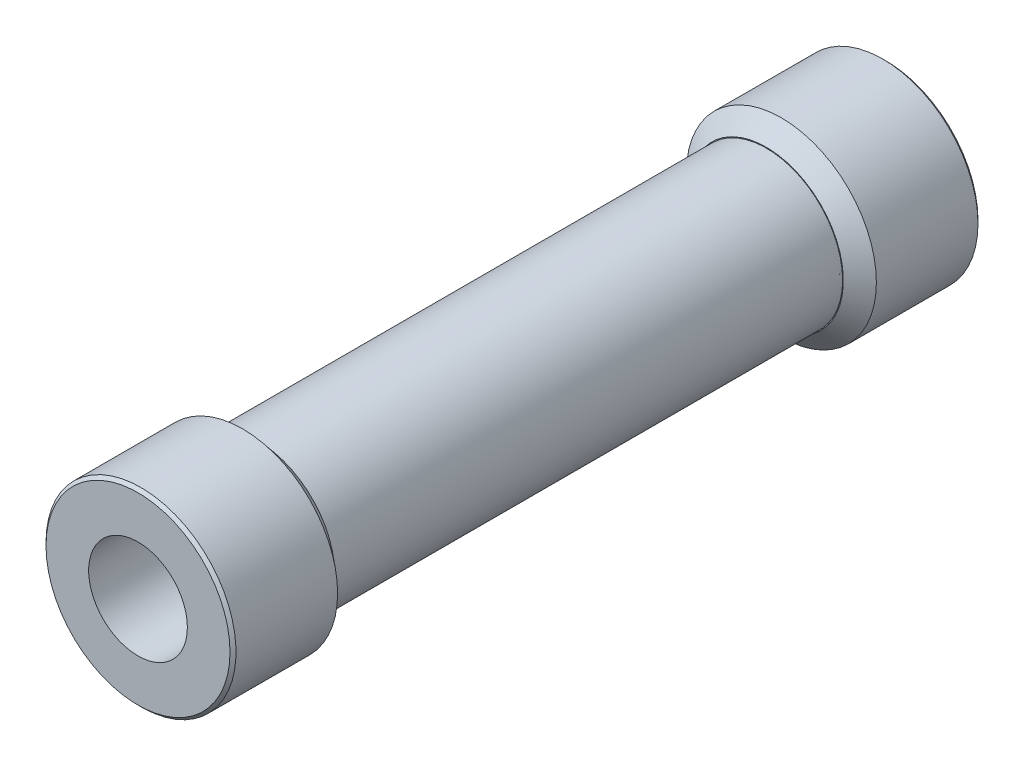
ISO-10303-21;
HEADER;
FILE_DESCRIPTION(('STEP AP214'),'2;1');
FILE_NAME('part.step','',(''),(''),'','','');
FILE_SCHEMA(('AUTOMOTIVE_DESIGN { 1 0 10303 214 1 1 1 1 }'));
ENDSEC;
DATA;
#1=APPLICATION_CONTEXT('core data for automotive mechanical design processes');
#2=APPLICATION_PROTOCOL_DEFINITION('international standard','automotive_design',2000,#1);
#3=PRODUCT_CONTEXT('',#1,'mechanical');
#4=PRODUCT('Part','Part','',(#3));
#5=PRODUCT_RELATED_PRODUCT_CATEGORY('part','',(#4));
#6=PRODUCT_DEFINITION_FORMATION('','',#4);
#7=PRODUCT_DEFINITION_CONTEXT('part definition',#1,'design');
#8=PRODUCT_DEFINITION('design','',#6,#7);
#9=PRODUCT_DEFINITION_SHAPE('','',#8);
#10=(LENGTH_UNIT() NAMED_UNIT(*) SI_UNIT(.MILLI.,.METRE.));
#11=(NAMED_UNIT(*) PLANE_ANGLE_UNIT() SI_UNIT($,.RADIAN.));
#12=(NAMED_UNIT(*) SI_UNIT($,.STERADIAN.) SOLID_ANGLE_UNIT());
#13=UNCERTAINTY_MEASURE_WITH_UNIT(LENGTH_MEASURE(1.E-05),#10,'distance_accuracy_value','');
#14=(GEOMETRIC_REPRESENTATION_CONTEXT(3) GLOBAL_UNCERTAINTY_ASSIGNED_CONTEXT((#13)) GLOBAL_UNIT_ASSIGNED_CONTEXT((#10,
#11,#12)) REPRESENTATION_CONTEXT('',''));
#15=CARTESIAN_POINT('',(0.,0.,0.));
#16=DIRECTION('',(0.,0.,1.));
#17=DIRECTION('',(1.,0.,0.));
#18=AXIS2_PLACEMENT_3D('',#15,#16,#17);
#19=CARTESIAN_POINT('',(0.,0.,15.5449330783939));
#20=DIRECTION('',(0.,0.,1.));
#21=DIRECTION('',(1.,0.,0.));
#22=AXIS2_PLACEMENT_3D('',#19,#20,#21);
#23=CYLINDRICAL_SURFACE('',#22,2.55);
#24=CARTESIAN_POINT('',(0.,0.,8.5));
#25=DIRECTION('',(0.,0.,1.));
#26=DIRECTION('',(1.,0.,0.));
#27=AXIS2_PLACEMENT_3D('',#24,#25,#26);
#28=CIRCLE('',#27,2.55);
#29=CARTESIAN_POINT('',(2.55,0.,8.5));
#30=VERTEX_POINT('',#29);
#31=EDGE_CURVE('E64',#30,#30,#28,.T.);
#32=ORIENTED_EDGE('',*,*,#31,.F.);
#33=EDGE_LOOP('',(#32));
#34=FACE_BOUND('',#33,.T.);
#35=CARTESIAN_POINT('',(0.,0.,-8.5));
#36=DIRECTION('',(0.,0.,1.));
#37=DIRECTION('',(1.,0.,0.));
#38=AXIS2_PLACEMENT_3D('',#35,#36,#37);
#39=CIRCLE('',#38,2.55);
#40=CARTESIAN_POINT('',(2.55,0.,-8.5));
#41=VERTEX_POINT('',#40);
#42=EDGE_CURVE('E73',#41,#41,#39,.T.);
#43=ORIENTED_EDGE('',*,*,#42,.T.);
#44=EDGE_LOOP('',(#43));
#45=FACE_BOUND('',#44,.T.);
#46=ADVANCED_FACE('F43',(#34,#45),#23,.T.);
#47=CARTESIAN_POINT('',(0.,0.,-8.5));
#48=DIRECTION('',(0.,0.,-1.));
#49=DIRECTION('',(-1.,0.,0.));
#50=AXIS2_PLACEMENT_3D('',#47,#48,#49);
#51=CONICAL_SURFACE('',#50,2.575,0.872664625997167);
#52=CARTESIAN_POINT('',(0.,0.,-9.00345977870637));
#53=DIRECTION('',(0.,0.,-1.));
#54=DIRECTION('',(-1.,0.,0.));
#55=AXIS2_PLACEMENT_3D('',#52,#53,#54);
#56=CIRCLE('',#55,3.175);
#57=CARTESIAN_POINT('',(-3.175,0.,-9.00345977870637));
#58=VERTEX_POINT('',#57);
#59=EDGE_CURVE('E70',#58,#58,#56,.T.);
#60=ORIENTED_EDGE('',*,*,#59,.F.);
#61=EDGE_LOOP('',(#60));
#62=FACE_BOUND('',#61,.T.);
#63=CARTESIAN_POINT('',(0.,0.,-8.5));
#64=DIRECTION('',(0.,0.,-1.));
#65=DIRECTION('',(-1.,0.,0.));
#66=AXIS2_PLACEMENT_3D('',#63,#64,#65);
#67=CIRCLE('',#66,2.575);
#68=CARTESIAN_POINT('',(-2.575,0.,-8.5));
#69=VERTEX_POINT('',#68);
#70=EDGE_CURVE('E68',#69,#69,#67,.T.);
#71=ORIENTED_EDGE('',*,*,#70,.T.);
#72=EDGE_LOOP('',(#71));
#73=FACE_BOUND('',#72,.T.);
#74=ADVANCED_FACE('F105',(#62,#73),#51,.T.);
#75=CARTESIAN_POINT('',(0.,0.,-8.5));
#76=DIRECTION('',(0.,0.,-1.));
#77=DIRECTION('',(-1.,0.,0.));
#78=AXIS2_PLACEMENT_3D('',#75,#76,#77);
#79=PLANE('',#78);
#80=ORIENTED_EDGE('',*,*,#42,.F.);
#81=EDGE_LOOP('',(#80));
#82=FACE_BOUND('',#81,.T.);
#83=ORIENTED_EDGE('',*,*,#70,.F.);
#84=EDGE_LOOP('',(#83));
#85=FACE_BOUND('',#84,.T.);
#86=ADVANCED_FACE('F111',(#82,#85),#79,.F.);
#87=CARTESIAN_POINT('',(0.,0.,-12.5));
#88=DIRECTION('',(0.,0.,1.));
#89=DIRECTION('',(1.,0.,0.));
#90=AXIS2_PLACEMENT_3D('',#87,#88,#89);
#91=CYLINDRICAL_SURFACE('',#90,3.175);
#92=CARTESIAN_POINT('',(0.,0.,-12.4));
#93=DIRECTION('',(0.,0.,-1.));
#94=DIRECTION('',(-1.,0.,0.));
#95=AXIS2_PLACEMENT_3D('',#92,#93,#94);
#96=CIRCLE('',#95,3.175);
#97=CARTESIAN_POINT('',(3.175,0.,-12.4));
#98=VERTEX_POINT('',#97);
#99=EDGE_CURVE('E55',#98,#98,#96,.F.);
#100=ORIENTED_EDGE('',*,*,#99,.T.);
#101=EDGE_LOOP('',(#100));
#102=FACE_BOUND('',#101,.T.);
#103=ORIENTED_EDGE('',*,*,#59,.T.);
#104=EDGE_LOOP('',(#103));
#105=FACE_BOUND('',#104,.T.);
#106=ADVANCED_FACE('F138',(#102,#105),#91,.T.);
#107=CARTESIAN_POINT('',(0.,0.,-12.5));
#108=DIRECTION('',(0.,0.,-1.));
#109=DIRECTION('',(-1.,0.,0.));
#110=AXIS2_PLACEMENT_3D('',#107,#108,#109);
#111=PLANE('',#110);
#112=CARTESIAN_POINT('',(0.,0.,-12.5));
#113=DIRECTION('',(0.,0.,-1.));
#114=DIRECTION('',(-1.,0.,0.));
#115=AXIS2_PLACEMENT_3D('',#112,#113,#114);
#116=CIRCLE('',#115,3.075);
#117=CARTESIAN_POINT('',(3.07500000000001,0.,-12.5));
#118=VERTEX_POINT('',#117);
#119=EDGE_CURVE('E59',#118,#118,#116,.T.);
#120=ORIENTED_EDGE('',*,*,#119,.T.);
#121=EDGE_LOOP('',(#120));
#122=FACE_BOUND('',#121,.T.);
#123=CARTESIAN_POINT('',(0.,0.,-12.5));
#124=DIRECTION('',(0.,0.,-1.));
#125=DIRECTION('',(-1.,0.,0.));
#126=AXIS2_PLACEMENT_3D('',#123,#124,#125);
#127=CIRCLE('',#126,1.65);
#128=CARTESIAN_POINT('',(-1.65,0.,-12.5));
#129=VERTEX_POINT('',#128);
#130=EDGE_CURVE('E82',#129,#129,#127,.T.);
#131=ORIENTED_EDGE('',*,*,#130,.F.);
#132=EDGE_LOOP('',(#131));
#133=FACE_BOUND('',#132,.T.);
#134=ADVANCED_FACE('F121',(#122,#133),#111,.T.);
#135=CARTESIAN_POINT('',(0.,0.,8.5));
#136=DIRECTION('',(0.,0.,1.));
#137=DIRECTION('',(1.,0.,0.));
#138=AXIS2_PLACEMENT_3D('',#135,#136,#137);
#139=CONICAL_SURFACE('',#138,2.575,0.872664625997167);
#140=CARTESIAN_POINT('',(0.,0.,9.00345977870637));
#141=DIRECTION('',(0.,0.,1.));
#142=DIRECTION('',(1.,0.,0.));
#143=AXIS2_PLACEMENT_3D('',#140,#141,#142);
#144=CIRCLE('',#143,3.175);
#145=CARTESIAN_POINT('',(3.175,0.,9.00345977870637));
#146=VERTEX_POINT('',#145);
#147=EDGE_CURVE('E65',#146,#146,#144,.T.);
#148=ORIENTED_EDGE('',*,*,#147,.F.);
#149=EDGE_LOOP('',(#148));
#150=FACE_BOUND('',#149,.T.);
#151=CARTESIAN_POINT('',(0.,0.,8.5));
#152=DIRECTION('',(0.,0.,1.));
#153=DIRECTION('',(1.,0.,0.));
#154=AXIS2_PLACEMENT_3D('',#151,#152,#153);
#155=CIRCLE('',#154,2.575);
#156=CARTESIAN_POINT('',(2.575,0.,8.5));
#157=VERTEX_POINT('',#156);
#158=EDGE_CURVE('E69',#157,#157,#155,.T.);
#159=ORIENTED_EDGE('',*,*,#158,.T.);
#160=EDGE_LOOP('',(#159));
#161=FACE_BOUND('',#160,.T.);
#162=ADVANCED_FACE('F119',(#150,#161),#139,.T.);
#163=CARTESIAN_POINT('',(0.,0.,8.5));
#164=DIRECTION('',(0.,0.,1.));
#165=DIRECTION('',(1.,0.,0.));
#166=AXIS2_PLACEMENT_3D('',#163,#164,#165);
#167=PLANE('',#166);
#168=ORIENTED_EDGE('',*,*,#31,.T.);
#169=EDGE_LOOP('',(#168));
#170=FACE_BOUND('',#169,.T.);
#171=ORIENTED_EDGE('',*,*,#158,.F.);
#172=EDGE_LOOP('',(#171));
#173=FACE_BOUND('',#172,.T.);
#174=ADVANCED_FACE('F102',(#170,#173),#167,.F.);
#175=CARTESIAN_POINT('',(0.,0.,12.5));
#176=DIRECTION('',(0.,0.,-1.));
#177=DIRECTION('',(-1.,0.,0.));
#178=AXIS2_PLACEMENT_3D('',#175,#176,#177);
#179=CYLINDRICAL_SURFACE('',#178,3.175);
#180=CARTESIAN_POINT('',(0.,0.,12.4));
#181=DIRECTION('',(0.,0.,1.));
#182=DIRECTION('',(1.,0.,0.));
#183=AXIS2_PLACEMENT_3D('',#180,#181,#182);
#184=CIRCLE('',#183,3.175);
#185=CARTESIAN_POINT('',(-3.175,0.,12.4));
#186=VERTEX_POINT('',#185);
#187=EDGE_CURVE('E10',#186,#186,#184,.F.);
#188=ORIENTED_EDGE('',*,*,#187,.T.);
#189=EDGE_LOOP('',(#188));
#190=FACE_BOUND('',#189,.T.);
#191=ORIENTED_EDGE('',*,*,#147,.T.);
#192=EDGE_LOOP('',(#191));
#193=FACE_BOUND('',#192,.T.);
#194=ADVANCED_FACE('F93',(#190,#193),#179,.T.);
#195=CARTESIAN_POINT('',(0.,0.,12.5));
#196=DIRECTION('',(0.,0.,1.));
#197=DIRECTION('',(1.,0.,0.));
#198=AXIS2_PLACEMENT_3D('',#195,#196,#197);
#199=PLANE('',#198);
#200=CARTESIAN_POINT('',(0.,0.,12.5));
#201=DIRECTION('',(0.,0.,1.));
#202=DIRECTION('',(1.,0.,0.));
#203=AXIS2_PLACEMENT_3D('',#200,#201,#202);
#204=CIRCLE('',#203,3.075);
#205=CARTESIAN_POINT('',(-3.07500000000001,0.,12.5));
#206=VERTEX_POINT('',#205);
#207=EDGE_CURVE('E51',#206,#206,#204,.T.);
#208=ORIENTED_EDGE('',*,*,#207,.T.);
#209=EDGE_LOOP('',(#208));
#210=FACE_BOUND('',#209,.T.);
#211=CARTESIAN_POINT('',(0.,0.,12.5));
#212=DIRECTION('',(0.,0.,1.));
#213=DIRECTION('',(1.,0.,0.));
#214=AXIS2_PLACEMENT_3D('',#211,#212,#213);
#215=CIRCLE('',#214,1.65);
#216=CARTESIAN_POINT('',(1.65,0.,12.5));
#217=VERTEX_POINT('',#216);
#218=EDGE_CURVE('E85',#217,#217,#215,.T.);
#219=ORIENTED_EDGE('',*,*,#218,.F.);
#220=EDGE_LOOP('',(#219));
#221=FACE_BOUND('',#220,.T.);
#222=ADVANCED_FACE('F91',(#210,#221),#199,.T.);
#223=CARTESIAN_POINT('',(0.,0.,-87.5));
#224=DIRECTION('',(0.,0.,1.));
#225=DIRECTION('',(1.,0.,0.));
#226=AXIS2_PLACEMENT_3D('',#223,#224,#225);
#227=CYLINDRICAL_SURFACE('',#226,1.65);
#228=ORIENTED_EDGE('',*,*,#130,.T.);
#229=EDGE_LOOP('',(#228));
#230=FACE_BOUND('',#229,.T.);
#231=ORIENTED_EDGE('',*,*,#218,.T.);
#232=EDGE_LOOP('',(#231));
#233=FACE_BOUND('',#232,.T.);
#234=ADVANCED_FACE('F89',(#230,#233),#227,.F.);
#235=CARTESIAN_POINT('',(0.,0.,-12.5));
#236=DIRECTION('',(0.,0.,1.));
#237=DIRECTION('',(1.,0.,0.));
#238=AXIS2_PLACEMENT_3D('',#235,#236,#237);
#239=CONICAL_SURFACE('',#238,3.075,0.785398163397453);
#240=CARTESIAN_POINT('',(3.175,0.,-12.4));
#241=CARTESIAN_POINT('',(3.17395833333333,0.,-12.4010416666667));
#242=CARTESIAN_POINT('',(3.17291666666667,0.,-12.4020833333333));
#243=CARTESIAN_POINT('',(3.17083333333333,0.,-12.4041666666667));
#244=CARTESIAN_POINT('',(3.16979166666667,0.,-12.4052083333333));
#245=CARTESIAN_POINT('',(3.16770833333333,0.,-12.4072916666667));
#246=CARTESIAN_POINT('',(3.16666666666667,0.,-12.4083333333333));
#247=CARTESIAN_POINT('',(3.16458333333333,0.,-12.4104166666667));
#248=CARTESIAN_POINT('',(3.16354166666667,0.,-12.4114583333333));
#249=CARTESIAN_POINT('',(3.16145833333333,0.,-12.4135416666667));
#250=CARTESIAN_POINT('',(3.16041666666667,0.,-12.4145833333333));
#251=CARTESIAN_POINT('',(3.15833333333333,0.,-12.4166666666667));
#252=CARTESIAN_POINT('',(3.15729166666667,0.,-12.4177083333333));
#253=CARTESIAN_POINT('',(3.15520833333334,0.,-12.4197916666667));
#254=CARTESIAN_POINT('',(3.15416666666667,0.,-12.4208333333333));
#255=CARTESIAN_POINT('',(3.15208333333334,0.,-12.4229166666667));
#256=CARTESIAN_POINT('',(3.15104166666667,0.,-12.4239583333333));
#257=CARTESIAN_POINT('',(3.14895833333334,0.,-12.4260416666667));
#258=CARTESIAN_POINT('',(3.14791666666667,0.,-12.4270833333333));
#259=CARTESIAN_POINT('',(3.14583333333334,0.,-12.4291666666667));
#260=CARTESIAN_POINT('',(3.14479166666667,0.,-12.4302083333333));
#261=CARTESIAN_POINT('',(3.14270833333334,0.,-12.4322916666667));
#262=CARTESIAN_POINT('',(3.14166666666667,0.,-12.4333333333333));
#263=CARTESIAN_POINT('',(3.13958333333334,0.,-12.4354166666667));
#264=CARTESIAN_POINT('',(3.13854166666667,0.,-12.4364583333333));
#265=CARTESIAN_POINT('',(3.13645833333334,0.,-12.4385416666667));
#266=CARTESIAN_POINT('',(3.13541666666667,0.,-12.4395833333333));
#267=CARTESIAN_POINT('',(3.13333333333334,0.,-12.4416666666667));
#268=CARTESIAN_POINT('',(3.13229166666667,0.,-12.4427083333333));
#269=CARTESIAN_POINT('',(3.13020833333334,0.,-12.4447916666667));
#270=CARTESIAN_POINT('',(3.12916666666667,0.,-12.4458333333333));
#271=CARTESIAN_POINT('',(3.12708333333334,0.,-12.4479166666667));
#272=CARTESIAN_POINT('',(3.12604166666667,0.,-12.4489583333333));
#273=CARTESIAN_POINT('',(3.12395833333334,0.,-12.4510416666667));
#274=CARTESIAN_POINT('',(3.12291666666667,0.,-12.4520833333333));
#275=CARTESIAN_POINT('',(3.12083333333334,0.,-12.4541666666667));
#276=CARTESIAN_POINT('',(3.11979166666667,0.,-12.4552083333333));
#277=CARTESIAN_POINT('',(3.11770833333334,0.,-12.4572916666667));
#278=CARTESIAN_POINT('',(3.11666666666667,0.,-12.4583333333333));
#279=CARTESIAN_POINT('',(3.11458333333334,0.,-12.4604166666667));
#280=CARTESIAN_POINT('',(3.11354166666667,0.,-12.4614583333333));
#281=CARTESIAN_POINT('',(3.11145833333334,0.,-12.4635416666667));
#282=CARTESIAN_POINT('',(3.11041666666667,0.,-12.4645833333333));
#283=CARTESIAN_POINT('',(3.10833333333334,0.,-12.4666666666667));
#284=CARTESIAN_POINT('',(3.10729166666667,0.,-12.4677083333333));
#285=CARTESIAN_POINT('',(3.10520833333334,0.,-12.4697916666667));
#286=CARTESIAN_POINT('',(3.10416666666667,0.,-12.4708333333333));
#287=CARTESIAN_POINT('',(3.10208333333334,0.,-12.4729166666667));
#288=CARTESIAN_POINT('',(3.10104166666667,0.,-12.4739583333333));
#289=CARTESIAN_POINT('',(3.09895833333334,0.,-12.4760416666667));
#290=CARTESIAN_POINT('',(3.09791666666667,0.,-12.4770833333333));
#291=CARTESIAN_POINT('',(3.09583333333334,0.,-12.4791666666667));
#292=CARTESIAN_POINT('',(3.09479166666667,0.,-12.4802083333333));
#293=CARTESIAN_POINT('',(3.09270833333334,0.,-12.4822916666667));
#294=CARTESIAN_POINT('',(3.09166666666667,0.,-12.4833333333333));
#295=CARTESIAN_POINT('',(3.08958333333334,0.,-12.4854166666667));
#296=CARTESIAN_POINT('',(3.08854166666667,0.,-12.4864583333333));
#297=CARTESIAN_POINT('',(3.08645833333334,0.,-12.4885416666667));
#298=CARTESIAN_POINT('',(3.08541666666667,0.,-12.4895833333333));
#299=CARTESIAN_POINT('',(3.08333333333334,0.,-12.4916666666667));
#300=CARTESIAN_POINT('',(3.08229166666667,0.,-12.4927083333333));
#301=CARTESIAN_POINT('',(3.08020833333334,0.,-12.4947916666667));
#302=CARTESIAN_POINT('',(3.07916666666667,0.,-12.4958333333333));
#303=CARTESIAN_POINT('',(3.07708333333334,0.,-12.4979166666667));
#304=CARTESIAN_POINT('',(3.07604166666667,0.,-12.4989583333333));
#305=CARTESIAN_POINT('',(3.07500000000001,0.,-12.5));
#306=B_SPLINE_CURVE_WITH_KNOTS('',3,(#240,#241,#242,#243,#244,#245,#246,#247,#248,#249,#250,
#251,#252,#253,#254,#255,#256,#257,#258,#259,#260,#261,#262,#263,#264,#265,#266,#267,#268,#269,
#270,#271,#272,#273,#274,#275,#276,#277,#278,#279,#280,#281,#282,#283,#284,#285,#286,#287,#288,
#289,#290,#291,#292,#293,#294,#295,#296,#297,#298,#299,#300,#301,#302,#303,#304,#305),
.UNSPECIFIED.,.F.,.F.,(4,2,2,2,2,2,2,2,2,2,2,2,2,2,2,2,2,2,2,2,2,2,2,2,2,2,2,2,2,2,2,2,4),(0.,
0.00441941738241544,0.00883883476483118,0.0132582521472466,0.0176776695296624,
0.0220970869120778,0.0265165042944935,0.030935921676909,0.0353553390593244,0.0397747564417401,
0.0441941738241556,0.0486135912065725,0.053033008588988,0.0574524259714037,0.0618718433538192,
0.0662912607362349,0.0707106781186503,0.0751300955010658,0.0795495128834815,0.083968930265897,
0.0883883476483127,0.0928077650307281,0.0972271824131451,0.101646599795561,0.106066017177976,
0.110485434560392,0.114904851942807,0.119324269325223,0.123743686707638,0.128163104090054,
0.13258252147247,0.137001938854885,0.141421356237302),.UNSPECIFIED.);
#307=EDGE_CURVE('BSEAM99',#98,#118,#306,.T.);
#308=ORIENTED_EDGE('',*,*,#99,.F.);
#309=ORIENTED_EDGE('',*,*,#119,.F.);
#310=ORIENTED_EDGE('',*,*,#307,.T.);
#311=ORIENTED_EDGE('',*,*,#307,.F.);
#312=EDGE_LOOP('',(#308,#310,#309,#311));
#313=FACE_BOUND('',#312,.T.);
#314=ADVANCED_FACE('F99',(#313),#239,.T.);
#315=CARTESIAN_POINT('',(0.,0.,12.5));
#316=DIRECTION('',(0.,0.,-1.));
#317=DIRECTION('',(-1.,0.,0.));
#318=AXIS2_PLACEMENT_3D('',#315,#316,#317);
#319=CONICAL_SURFACE('',#318,3.075,0.785398163397453);
#320=CARTESIAN_POINT('',(-3.175,0.,12.4));
#321=CARTESIAN_POINT('',(-3.17395833333333,0.,12.4010416666667));
#322=CARTESIAN_POINT('',(-3.17291666666667,0.,12.4020833333333));
#323=CARTESIAN_POINT('',(-3.17083333333333,0.,12.4041666666667));
#324=CARTESIAN_POINT('',(-3.16979166666667,0.,12.4052083333333));
#325=CARTESIAN_POINT('',(-3.16770833333333,0.,12.4072916666667));
#326=CARTESIAN_POINT('',(-3.16666666666667,0.,12.4083333333333));
#327=CARTESIAN_POINT('',(-3.16458333333333,0.,12.4104166666667));
#328=CARTESIAN_POINT('',(-3.16354166666667,0.,12.4114583333333));
#329=CARTESIAN_POINT('',(-3.16145833333333,0.,12.4135416666667));
#330=CARTESIAN_POINT('',(-3.16041666666667,0.,12.4145833333333));
#331=CARTESIAN_POINT('',(-3.15833333333333,0.,12.4166666666667));
#332=CARTESIAN_POINT('',(-3.15729166666667,0.,12.4177083333333));
#333=CARTESIAN_POINT('',(-3.15520833333334,0.,12.4197916666667));
#334=CARTESIAN_POINT('',(-3.15416666666667,0.,12.4208333333333));
#335=CARTESIAN_POINT('',(-3.15208333333334,0.,12.4229166666667));
#336=CARTESIAN_POINT('',(-3.15104166666667,0.,12.4239583333333));
#337=CARTESIAN_POINT('',(-3.14895833333334,0.,12.4260416666667));
#338=CARTESIAN_POINT('',(-3.14791666666667,0.,12.4270833333333));
#339=CARTESIAN_POINT('',(-3.14583333333334,0.,12.4291666666667));
#340=CARTESIAN_POINT('',(-3.14479166666667,0.,12.4302083333333));
#341=CARTESIAN_POINT('',(-3.14270833333334,0.,12.4322916666667));
#342=CARTESIAN_POINT('',(-3.14166666666667,0.,12.4333333333333));
#343=CARTESIAN_POINT('',(-3.13958333333334,0.,12.4354166666667));
#344=CARTESIAN_POINT('',(-3.13854166666667,0.,12.4364583333333));
#345=CARTESIAN_POINT('',(-3.13645833333334,0.,12.4385416666667));
#346=CARTESIAN_POINT('',(-3.13541666666667,0.,12.4395833333333));
#347=CARTESIAN_POINT('',(-3.13333333333334,0.,12.4416666666667));
#348=CARTESIAN_POINT('',(-3.13229166666667,0.,12.4427083333333));
#349=CARTESIAN_POINT('',(-3.13020833333334,0.,12.4447916666667));
#350=CARTESIAN_POINT('',(-3.12916666666667,0.,12.4458333333333));
#351=CARTESIAN_POINT('',(-3.12708333333334,0.,12.4479166666667));
#352=CARTESIAN_POINT('',(-3.12604166666667,0.,12.4489583333333));
#353=CARTESIAN_POINT('',(-3.12395833333334,0.,12.4510416666667));
#354=CARTESIAN_POINT('',(-3.12291666666667,0.,12.4520833333333));
#355=CARTESIAN_POINT('',(-3.12083333333334,0.,12.4541666666667));
#356=CARTESIAN_POINT('',(-3.11979166666667,0.,12.4552083333333));
#357=CARTESIAN_POINT('',(-3.11770833333334,0.,12.4572916666667));
#358=CARTESIAN_POINT('',(-3.11666666666667,0.,12.4583333333333));
#359=CARTESIAN_POINT('',(-3.11458333333334,0.,12.4604166666667));
#360=CARTESIAN_POINT('',(-3.11354166666667,0.,12.4614583333333));
#361=CARTESIAN_POINT('',(-3.11145833333334,0.,12.4635416666667));
#362=CARTESIAN_POINT('',(-3.11041666666667,0.,12.4645833333333));
#363=CARTESIAN_POINT('',(-3.10833333333334,0.,12.4666666666667));
#364=CARTESIAN_POINT('',(-3.10729166666667,0.,12.4677083333333));
#365=CARTESIAN_POINT('',(-3.10520833333334,0.,12.4697916666667));
#366=CARTESIAN_POINT('',(-3.10416666666667,0.,12.4708333333333));
#367=CARTESIAN_POINT('',(-3.10208333333334,0.,12.4729166666667));
#368=CARTESIAN_POINT('',(-3.10104166666667,0.,12.4739583333333));
#369=CARTESIAN_POINT('',(-3.09895833333334,0.,12.4760416666667));
#370=CARTESIAN_POINT('',(-3.09791666666667,0.,12.4770833333333));
#371=CARTESIAN_POINT('',(-3.09583333333334,0.,12.4791666666667));
#372=CARTESIAN_POINT('',(-3.09479166666667,0.,12.4802083333333));
#373=CARTESIAN_POINT('',(-3.09270833333334,0.,12.4822916666667));
#374=CARTESIAN_POINT('',(-3.09166666666667,0.,12.4833333333333));
#375=CARTESIAN_POINT('',(-3.08958333333334,0.,12.4854166666667));
#376=CARTESIAN_POINT('',(-3.08854166666667,0.,12.4864583333333));
#377=CARTESIAN_POINT('',(-3.08645833333334,0.,12.4885416666667));
#378=CARTESIAN_POINT('',(-3.08541666666667,0.,12.4895833333333));
#379=CARTESIAN_POINT('',(-3.08333333333334,0.,12.4916666666667));
#380=CARTESIAN_POINT('',(-3.08229166666667,0.,12.4927083333333));
#381=CARTESIAN_POINT('',(-3.08020833333334,0.,12.4947916666667));
#382=CARTESIAN_POINT('',(-3.07916666666667,0.,12.4958333333333));
#383=CARTESIAN_POINT('',(-3.07708333333334,0.,12.4979166666667));
#384=CARTESIAN_POINT('',(-3.07604166666667,0.,12.4989583333333));
#385=CARTESIAN_POINT('',(-3.07500000000001,0.,12.5));
#386=B_SPLINE_CURVE_WITH_KNOTS('',3,(#320,#321,#322,#323,#324,#325,#326,#327,#328,#329,#330,
#331,#332,#333,#334,#335,#336,#337,#338,#339,#340,#341,#342,#343,#344,#345,#346,#347,#348,#349,
#350,#351,#352,#353,#354,#355,#356,#357,#358,#359,#360,#361,#362,#363,#364,#365,#366,#367,#368,
#369,#370,#371,#372,#373,#374,#375,#376,#377,#378,#379,#380,#381,#382,#383,#384,#385),
.UNSPECIFIED.,.F.,.F.,(4,2,2,2,2,2,2,2,2,2,2,2,2,2,2,2,2,2,2,2,2,2,2,2,2,2,2,2,2,2,2,2,4),(0.,
0.00441941738241544,0.00883883476483118,0.0132582521472466,0.0176776695296624,
0.0220970869120778,0.0265165042944935,0.030935921676909,0.0353553390593244,0.0397747564417401,
0.0441941738241556,0.0486135912065725,0.053033008588988,0.0574524259714037,0.0618718433538192,
0.0662912607362349,0.0707106781186503,0.0751300955010658,0.0795495128834815,0.083968930265897,
0.0883883476483127,0.0928077650307281,0.0972271824131451,0.101646599795561,0.106066017177976,
0.110485434560392,0.114904851942807,0.119324269325223,0.123743686707638,0.128163104090054,
0.13258252147247,0.137001938854885,0.141421356237302),.UNSPECIFIED.);
#387=EDGE_CURVE('BSEAM46',#186,#206,#386,.T.);
#388=ORIENTED_EDGE('',*,*,#187,.F.);
#389=ORIENTED_EDGE('',*,*,#207,.F.);
#390=ORIENTED_EDGE('',*,*,#387,.T.);
#391=ORIENTED_EDGE('',*,*,#387,.F.);
#392=EDGE_LOOP('',(#388,#390,#389,#391));
#393=FACE_BOUND('',#392,.T.);
#394=ADVANCED_FACE('F46',(#393),#319,.T.);
#395=CLOSED_SHELL('',(#46,#74,#86,#106,#134,#162,#174,#194,#222,#234,#314,#394));
#396=MANIFOLD_SOLID_BREP('B2',#395);
#397=ADVANCED_BREP_SHAPE_REPRESENTATION('',(#18,#396),#14);
#398=SHAPE_DEFINITION_REPRESENTATION(#9,#397);
ENDSEC;
END-ISO-10303-21;
